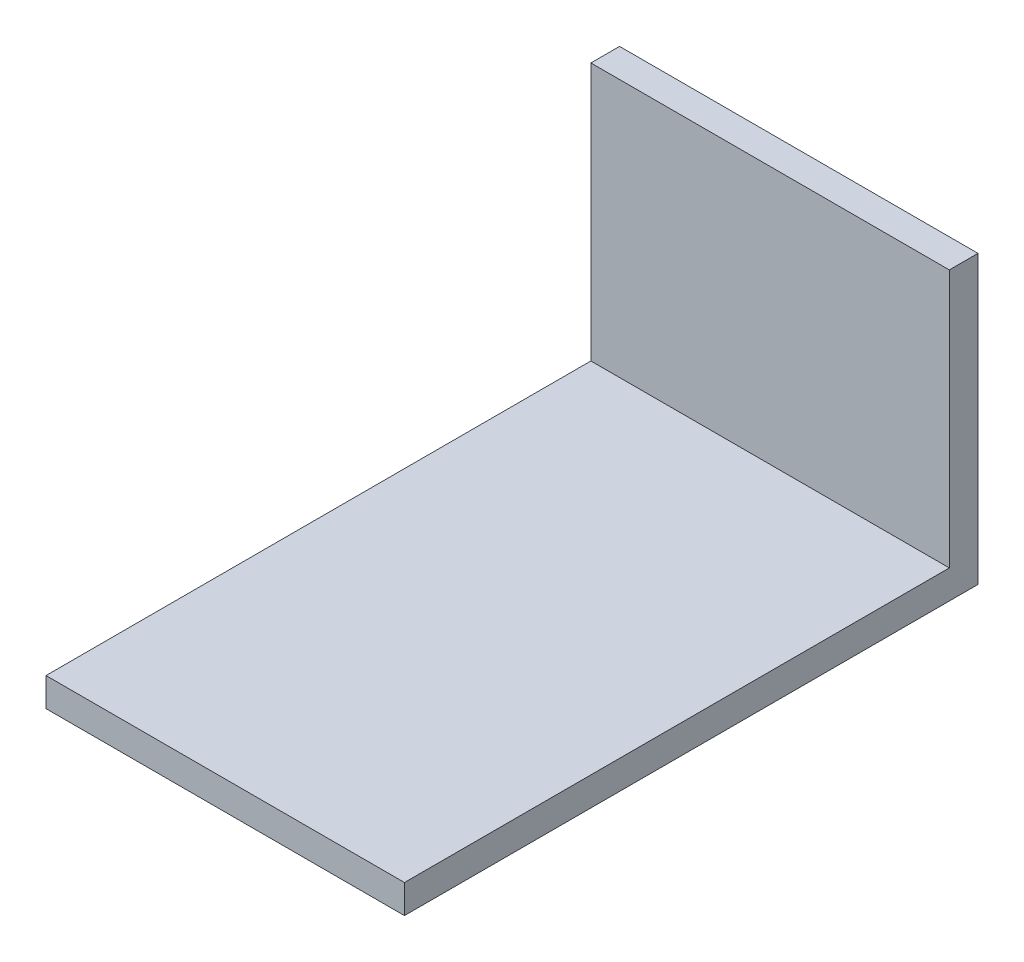
ISO-10303-21;
HEADER;
FILE_DESCRIPTION(('STEP AP214'),'2;1');
FILE_NAME('part.step','',(''),(''),'','','');
FILE_SCHEMA(('AUTOMOTIVE_DESIGN { 1 0 10303 214 1 1 1 1 }'));
ENDSEC;
DATA;
#1=APPLICATION_CONTEXT('core data for automotive mechanical design processes');
#2=APPLICATION_PROTOCOL_DEFINITION('international standard','automotive_design',2000,#1);
#3=PRODUCT_CONTEXT('',#1,'mechanical');
#4=PRODUCT('Part','Part','',(#3));
#5=PRODUCT_RELATED_PRODUCT_CATEGORY('part','',(#4));
#6=PRODUCT_DEFINITION_FORMATION('','',#4);
#7=PRODUCT_DEFINITION_CONTEXT('part definition',#1,'design');
#8=PRODUCT_DEFINITION('design','',#6,#7);
#9=PRODUCT_DEFINITION_SHAPE('','',#8);
#10=(LENGTH_UNIT() NAMED_UNIT(*) SI_UNIT(.MILLI.,.METRE.));
#11=(NAMED_UNIT(*) PLANE_ANGLE_UNIT() SI_UNIT($,.RADIAN.));
#12=(NAMED_UNIT(*) SI_UNIT($,.STERADIAN.) SOLID_ANGLE_UNIT());
#13=UNCERTAINTY_MEASURE_WITH_UNIT(LENGTH_MEASURE(1.E-05),#10,'distance_accuracy_value','');
#14=(GEOMETRIC_REPRESENTATION_CONTEXT(3) GLOBAL_UNCERTAINTY_ASSIGNED_CONTEXT((#13)) GLOBAL_UNIT_ASSIGNED_CONTEXT((#10,
#11,#12)) REPRESENTATION_CONTEXT('',''));
#15=CARTESIAN_POINT('',(0.,0.,0.));
#16=DIRECTION('',(0.,0.,1.));
#17=DIRECTION('',(1.,0.,0.));
#18=AXIS2_PLACEMENT_3D('',#15,#16,#17);
#19=CARTESIAN_POINT('',(50.,0.,80.));
#20=DIRECTION('',(0.,1.,0.));
#21=DIRECTION('',(0.,0.,1.));
#22=AXIS2_PLACEMENT_3D('',#19,#20,#21);
#23=PLANE('',#22);
#24=DIRECTION('',(0.,0.,-1.));
#25=VECTOR('',#24,1.);
#26=CARTESIAN_POINT('',(0.,0.,80.));
#27=LINE('',#26,#25);
#28=CARTESIAN_POINT('',(0.,0.,80.));
#29=VERTEX_POINT('',#28);
#30=CARTESIAN_POINT('',(0.,0.,0.));
#31=VERTEX_POINT('',#30);
#32=EDGE_CURVE('E117',#29,#31,#27,.T.);
#33=ORIENTED_EDGE('',*,*,#32,.T.);
#34=DIRECTION('',(-1.,0.,0.));
#35=VECTOR('',#34,1.);
#36=CARTESIAN_POINT('',(50.,0.,0.));
#37=LINE('',#36,#35);
#38=CARTESIAN_POINT('',(50.,0.,0.));
#39=VERTEX_POINT('',#38);
#40=EDGE_CURVE('E11',#39,#31,#37,.T.);
#41=ORIENTED_EDGE('',*,*,#40,.F.);
#42=DIRECTION('',(0.,0.,-1.));
#43=VECTOR('',#42,1.);
#44=CARTESIAN_POINT('',(50.,0.,80.));
#45=LINE('',#44,#43);
#46=CARTESIAN_POINT('',(50.,0.,80.));
#47=VERTEX_POINT('',#46);
#48=EDGE_CURVE('E127',#47,#39,#45,.T.);
#49=ORIENTED_EDGE('',*,*,#48,.F.);
#50=DIRECTION('',(-1.,0.,0.));
#51=VECTOR('',#50,1.);
#52=CARTESIAN_POINT('',(50.,0.,80.));
#53=LINE('',#52,#51);
#54=EDGE_CURVE('E113',#47,#29,#53,.T.);
#55=ORIENTED_EDGE('',*,*,#54,.T.);
#56=EDGE_LOOP('',(#33,#41,#49,#55));
#57=FACE_BOUND('',#56,.T.);
#58=ADVANCED_FACE('F33',(#57),#23,.F.);
#59=CARTESIAN_POINT('',(50.,0.,0.));
#60=DIRECTION('',(0.,0.,1.));
#61=DIRECTION('',(0.,-1.,0.));
#62=AXIS2_PLACEMENT_3D('',#59,#60,#61);
#63=PLANE('',#62);
#64=DIRECTION('',(0.,1.,0.));
#65=VECTOR('',#64,1.);
#66=CARTESIAN_POINT('',(0.,0.,0.));
#67=LINE('',#66,#65);
#68=CARTESIAN_POINT('',(0.,40.,0.));
#69=VERTEX_POINT('',#68);
#70=EDGE_CURVE('E120',#31,#69,#67,.T.);
#71=ORIENTED_EDGE('',*,*,#70,.T.);
#72=DIRECTION('',(-1.,0.,0.));
#73=VECTOR('',#72,1.);
#74=CARTESIAN_POINT('',(50.,40.,0.));
#75=LINE('',#74,#73);
#76=CARTESIAN_POINT('',(50.,40.,0.));
#77=VERTEX_POINT('',#76);
#78=EDGE_CURVE('E41',#77,#69,#75,.T.);
#79=ORIENTED_EDGE('',*,*,#78,.F.);
#80=DIRECTION('',(0.,1.,0.));
#81=VECTOR('',#80,1.);
#82=CARTESIAN_POINT('',(50.,0.,0.));
#83=LINE('',#82,#81);
#84=EDGE_CURVE('E86',#39,#77,#83,.T.);
#85=ORIENTED_EDGE('',*,*,#84,.F.);
#86=ORIENTED_EDGE('',*,*,#40,.T.);
#87=EDGE_LOOP('',(#71,#79,#85,#86));
#88=FACE_BOUND('',#87,.T.);
#89=ADVANCED_FACE('F151',(#88),#63,.F.);
#90=CARTESIAN_POINT('',(50.,40.,0.));
#91=DIRECTION('',(0.,-1.,0.));
#92=DIRECTION('',(0.,0.,-1.));
#93=AXIS2_PLACEMENT_3D('',#90,#91,#92);
#94=PLANE('',#93);
#95=DIRECTION('',(0.,0.,1.));
#96=VECTOR('',#95,1.);
#97=CARTESIAN_POINT('',(0.,40.,0.));
#98=LINE('',#97,#96);
#99=CARTESIAN_POINT('',(0.,40.,4.));
#100=VERTEX_POINT('',#99);
#101=EDGE_CURVE('E122',#69,#100,#98,.T.);
#102=ORIENTED_EDGE('',*,*,#101,.T.);
#103=DIRECTION('',(-1.,0.,0.));
#104=VECTOR('',#103,1.);
#105=CARTESIAN_POINT('',(50.,40.,4.));
#106=LINE('',#105,#104);
#107=CARTESIAN_POINT('',(50.,40.,4.));
#108=VERTEX_POINT('',#107);
#109=EDGE_CURVE('E108',#108,#100,#106,.T.);
#110=ORIENTED_EDGE('',*,*,#109,.F.);
#111=DIRECTION('',(0.,0.,1.));
#112=VECTOR('',#111,1.);
#113=CARTESIAN_POINT('',(50.,40.,0.));
#114=LINE('',#113,#112);
#115=EDGE_CURVE('E99',#77,#108,#114,.T.);
#116=ORIENTED_EDGE('',*,*,#115,.F.);
#117=ORIENTED_EDGE('',*,*,#78,.T.);
#118=EDGE_LOOP('',(#102,#110,#116,#117));
#119=FACE_BOUND('',#118,.T.);
#120=ADVANCED_FACE('F133',(#119),#94,.F.);
#121=CARTESIAN_POINT('',(50.,40.,4.));
#122=DIRECTION('',(0.,0.,-1.));
#123=DIRECTION('',(0.,1.,0.));
#124=AXIS2_PLACEMENT_3D('',#121,#122,#123);
#125=PLANE('',#124);
#126=DIRECTION('',(0.,-1.,0.));
#127=VECTOR('',#126,1.);
#128=CARTESIAN_POINT('',(0.,40.,4.));
#129=LINE('',#128,#127);
#130=CARTESIAN_POINT('',(0.,4.,4.));
#131=VERTEX_POINT('',#130);
#132=EDGE_CURVE('E107',#100,#131,#129,.T.);
#133=ORIENTED_EDGE('',*,*,#132,.T.);
#134=DIRECTION('',(-1.,0.,0.));
#135=VECTOR('',#134,1.);
#136=CARTESIAN_POINT('',(50.,4.,4.));
#137=LINE('',#136,#135);
#138=CARTESIAN_POINT('',(50.,4.,4.));
#139=VERTEX_POINT('',#138);
#140=EDGE_CURVE('E104',#139,#131,#137,.T.);
#141=ORIENTED_EDGE('',*,*,#140,.F.);
#142=DIRECTION('',(0.,-1.,0.));
#143=VECTOR('',#142,1.);
#144=CARTESIAN_POINT('',(50.,40.,4.));
#145=LINE('',#144,#143);
#146=EDGE_CURVE('E93',#108,#139,#145,.T.);
#147=ORIENTED_EDGE('',*,*,#146,.F.);
#148=ORIENTED_EDGE('',*,*,#109,.T.);
#149=EDGE_LOOP('',(#133,#141,#147,#148));
#150=FACE_BOUND('',#149,.T.);
#151=ADVANCED_FACE('F105',(#150),#125,.F.);
#152=CARTESIAN_POINT('',(50.,4.,4.));
#153=DIRECTION('',(0.,-1.,0.));
#154=DIRECTION('',(0.,0.,-1.));
#155=AXIS2_PLACEMENT_3D('',#152,#153,#154);
#156=PLANE('',#155);
#157=DIRECTION('',(0.,0.,1.));
#158=VECTOR('',#157,1.);
#159=CARTESIAN_POINT('',(0.,4.,4.));
#160=LINE('',#159,#158);
#161=CARTESIAN_POINT('',(0.,3.99999999999996,80.));
#162=VERTEX_POINT('',#161);
#163=EDGE_CURVE('E72',#131,#162,#160,.T.);
#164=ORIENTED_EDGE('',*,*,#163,.T.);
#165=DIRECTION('',(-1.,0.,0.));
#166=VECTOR('',#165,1.);
#167=CARTESIAN_POINT('',(50.,3.99999999999996,80.));
#168=LINE('',#167,#166);
#169=CARTESIAN_POINT('',(50.,3.99999999999996,80.));
#170=VERTEX_POINT('',#169);
#171=EDGE_CURVE('E109',#170,#162,#168,.T.);
#172=ORIENTED_EDGE('',*,*,#171,.F.);
#173=DIRECTION('',(0.,0.,1.));
#174=VECTOR('',#173,1.);
#175=CARTESIAN_POINT('',(50.,4.,4.));
#176=LINE('',#175,#174);
#177=EDGE_CURVE('E97',#139,#170,#176,.T.);
#178=ORIENTED_EDGE('',*,*,#177,.F.);
#179=ORIENTED_EDGE('',*,*,#140,.T.);
#180=EDGE_LOOP('',(#164,#172,#178,#179));
#181=FACE_BOUND('',#180,.T.);
#182=ADVANCED_FACE('F111',(#181),#156,.F.);
#183=CARTESIAN_POINT('',(50.,3.99999999999996,80.));
#184=DIRECTION('',(0.,0.,-1.));
#185=DIRECTION('',(-1.,0.,0.));
#186=AXIS2_PLACEMENT_3D('',#183,#184,#185);
#187=PLANE('',#186);
#188=DIRECTION('',(0.,-1.,0.));
#189=VECTOR('',#188,1.);
#190=CARTESIAN_POINT('',(0.,3.99999999999996,80.));
#191=LINE('',#190,#189);
#192=EDGE_CURVE('E78',#162,#29,#191,.T.);
#193=ORIENTED_EDGE('',*,*,#192,.T.);
#194=ORIENTED_EDGE('',*,*,#54,.F.);
#195=DIRECTION('',(0.,-1.,0.));
#196=VECTOR('',#195,1.);
#197=CARTESIAN_POINT('',(50.,3.99999999999996,80.));
#198=LINE('',#197,#196);
#199=EDGE_CURVE('E49',#170,#47,#198,.T.);
#200=ORIENTED_EDGE('',*,*,#199,.F.);
#201=ORIENTED_EDGE('',*,*,#171,.T.);
#202=EDGE_LOOP('',(#193,#194,#200,#201));
#203=FACE_BOUND('',#202,.T.);
#204=ADVANCED_FACE('F140',(#203),#187,.F.);
#205=CARTESIAN_POINT('',(50.,0.,0.));
#206=DIRECTION('',(1.,0.,0.));
#207=DIRECTION('',(0.,0.,-1.));
#208=AXIS2_PLACEMENT_3D('',#205,#206,#207);
#209=PLANE('',#208);
#210=ORIENTED_EDGE('',*,*,#48,.T.);
#211=ORIENTED_EDGE('',*,*,#84,.T.);
#212=ORIENTED_EDGE('',*,*,#115,.T.);
#213=ORIENTED_EDGE('',*,*,#146,.T.);
#214=ORIENTED_EDGE('',*,*,#177,.T.);
#215=ORIENTED_EDGE('',*,*,#199,.T.);
#216=EDGE_LOOP('',(#210,#211,#212,#213,#214,#215));
#217=FACE_BOUND('',#216,.T.);
#218=ADVANCED_FACE('F95',(#217),#209,.T.);
#219=CARTESIAN_POINT('',(0.,0.,0.));
#220=DIRECTION('',(1.,0.,0.));
#221=DIRECTION('',(0.,0.,-1.));
#222=AXIS2_PLACEMENT_3D('',#219,#220,#221);
#223=PLANE('',#222);
#224=ORIENTED_EDGE('',*,*,#32,.F.);
#225=ORIENTED_EDGE('',*,*,#192,.F.);
#226=ORIENTED_EDGE('',*,*,#163,.F.);
#227=ORIENTED_EDGE('',*,*,#132,.F.);
#228=ORIENTED_EDGE('',*,*,#101,.F.);
#229=ORIENTED_EDGE('',*,*,#70,.F.);
#230=EDGE_LOOP('',(#224,#225,#226,#227,#228,#229));
#231=FACE_BOUND('',#230,.T.);
#232=ADVANCED_FACE('F136',(#231),#223,.F.);
#233=CLOSED_SHELL('',(#58,#89,#120,#151,#182,#204,#218,#232));
#234=MANIFOLD_SOLID_BREP('B2',#233);
#235=ADVANCED_BREP_SHAPE_REPRESENTATION('',(#18,#234),#14);
#236=SHAPE_DEFINITION_REPRESENTATION(#9,#235);
ENDSEC;
END-ISO-10303-21;
